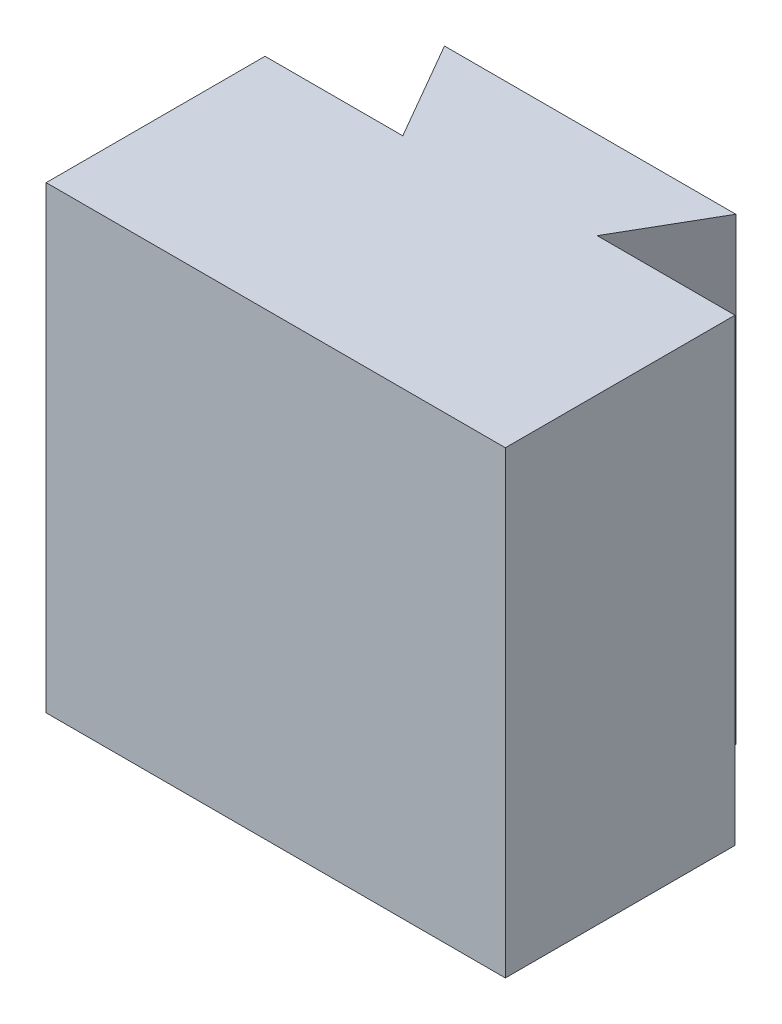
ISO-10303-21;
HEADER;
FILE_DESCRIPTION(('STEP AP214'),'2;1');
FILE_NAME('part.step','',(''),(''),'','','');
FILE_SCHEMA(('AUTOMOTIVE_DESIGN { 1 0 10303 214 1 1 1 1 }'));
ENDSEC;
DATA;
#1=APPLICATION_CONTEXT('core data for automotive mechanical design processes');
#2=APPLICATION_PROTOCOL_DEFINITION('international standard','automotive_design',2000,#1);
#3=PRODUCT_CONTEXT('',#1,'mechanical');
#4=PRODUCT('Part','Part','',(#3));
#5=PRODUCT_RELATED_PRODUCT_CATEGORY('part','',(#4));
#6=PRODUCT_DEFINITION_FORMATION('','',#4);
#7=PRODUCT_DEFINITION_CONTEXT('part definition',#1,'design');
#8=PRODUCT_DEFINITION('design','',#6,#7);
#9=PRODUCT_DEFINITION_SHAPE('','',#8);
#10=(LENGTH_UNIT() NAMED_UNIT(*) SI_UNIT(.MILLI.,.METRE.));
#11=(NAMED_UNIT(*) PLANE_ANGLE_UNIT() SI_UNIT($,.RADIAN.));
#12=(NAMED_UNIT(*) SI_UNIT($,.STERADIAN.) SOLID_ANGLE_UNIT());
#13=UNCERTAINTY_MEASURE_WITH_UNIT(LENGTH_MEASURE(1.E-05),#10,'distance_accuracy_value','');
#14=(GEOMETRIC_REPRESENTATION_CONTEXT(3) GLOBAL_UNCERTAINTY_ASSIGNED_CONTEXT((#13)) GLOBAL_UNIT_ASSIGNED_CONTEXT((#10,
#11,#12)) REPRESENTATION_CONTEXT('',''));
#15=CARTESIAN_POINT('',(0.,0.,0.));
#16=DIRECTION('',(0.,0.,1.));
#17=DIRECTION('',(1.,0.,0.));
#18=AXIS2_PLACEMENT_3D('',#15,#16,#17);
#19=CARTESIAN_POINT('',(-5.,-0.00999999999999959,0.234054964457145));
#20=DIRECTION('',(0.,0.,-1.));
#21=DIRECTION('',(-1.,0.,0.));
#22=AXIS2_PLACEMENT_3D('',#19,#20,#21);
#23=PLANE('',#22);
#24=DIRECTION('',(0.,1.,0.));
#25=VECTOR('',#24,1.);
#26=CARTESIAN_POINT('',(-2.,-0.00999999999999959,0.234054964457145));
#27=LINE('',#26,#25);
#28=CARTESIAN_POINT('',(-2.,0.,0.234054964457145));
#29=VERTEX_POINT('',#28);
#30=CARTESIAN_POINT('',(-2.,10.,0.234054964457145));
#31=VERTEX_POINT('',#30);
#32=EDGE_CURVE('E11',#29,#31,#27,.T.);
#33=ORIENTED_EDGE('',*,*,#32,.F.);
#34=DIRECTION('',(-1.,0.,0.));
#35=VECTOR('',#34,1.);
#36=CARTESIAN_POINT('',(0.,0.,0.234054964457145));
#37=LINE('',#36,#35);
#38=CARTESIAN_POINT('',(-5.,0.,0.234054964457145));
#39=VERTEX_POINT('',#38);
#40=EDGE_CURVE('E149',#29,#39,#37,.T.);
#41=ORIENTED_EDGE('',*,*,#40,.T.);
#42=DIRECTION('',(0.,1.,0.));
#43=VECTOR('',#42,1.);
#44=CARTESIAN_POINT('',(-5.,10.,0.234054964457145));
#45=LINE('',#44,#43);
#46=CARTESIAN_POINT('',(-5.,10.,0.234054964457145));
#47=VERTEX_POINT('',#46);
#48=EDGE_CURVE('E131',#39,#47,#45,.T.);
#49=ORIENTED_EDGE('',*,*,#48,.T.);
#50=DIRECTION('',(-1.,0.,0.));
#51=VECTOR('',#50,1.);
#52=CARTESIAN_POINT('',(0.,10.,0.234054964457145));
#53=LINE('',#52,#51);
#54=EDGE_CURVE('E165',#31,#47,#53,.T.);
#55=ORIENTED_EDGE('',*,*,#54,.F.);
#56=EDGE_LOOP('',(#33,#41,#49,#55));
#57=FACE_BOUND('',#56,.T.);
#58=ADVANCED_FACE('F43',(#57),#23,.T.);
#59=CARTESIAN_POINT('',(-2.,-0.00999999999999959,0.234054964457145));
#60=DIRECTION('',(-0.866025403784436,0.,0.500000000000004));
#61=DIRECTION('',(0.500000000000004,0.,0.866025403784436));
#62=AXIS2_PLACEMENT_3D('',#59,#60,#61);
#63=PLANE('',#62);
#64=DIRECTION('',(0.,1.,0.));
#65=VECTOR('',#64,1.);
#66=CARTESIAN_POINT('',(-3.2399584674678,-0.00999999999999959,-1.9136161004723));
#67=LINE('',#66,#65);
#68=CARTESIAN_POINT('',(-3.2399584674678,0.,-1.9136161004723));
#69=VERTEX_POINT('',#68);
#70=CARTESIAN_POINT('',(-3.2399584674678,10.,-1.9136161004723));
#71=VERTEX_POINT('',#70);
#72=EDGE_CURVE('E53',#69,#71,#67,.T.);
#73=ORIENTED_EDGE('',*,*,#72,.F.);
#74=DIRECTION('',(0.500000000000004,0.,0.866025403784436));
#75=VECTOR('',#74,1.);
#76=CARTESIAN_POINT('',(-1.60134877255087,0.,0.924539144898731));
#77=LINE('',#76,#75);
#78=EDGE_CURVE('E146',#69,#29,#77,.T.);
#79=ORIENTED_EDGE('',*,*,#78,.T.);
#80=ORIENTED_EDGE('',*,*,#32,.T.);
#81=DIRECTION('',(0.500000000000004,0.,0.866025403784436));
#82=VECTOR('',#81,1.);
#83=CARTESIAN_POINT('',(-1.60134877255087,10.,0.924539144898731));
#84=LINE('',#83,#82);
#85=EDGE_CURVE('E168',#71,#31,#84,.T.);
#86=ORIENTED_EDGE('',*,*,#85,.F.);
#87=EDGE_LOOP('',(#73,#79,#80,#86));
#88=FACE_BOUND('',#87,.T.);
#89=ADVANCED_FACE('F186',(#88),#63,.T.);
#90=CARTESIAN_POINT('',(-3.2399584674678,-0.00999999999999959,-1.9136161004723));
#91=DIRECTION('',(0.,0.,-1.));
#92=DIRECTION('',(-1.,0.,0.));
#93=AXIS2_PLACEMENT_3D('',#90,#91,#92);
#94=PLANE('',#93);
#95=DIRECTION('',(0.,1.,0.));
#96=VECTOR('',#95,1.);
#97=CARTESIAN_POINT('',(3.1048267707333,-0.00999999999999959,-1.9136161004723));
#98=LINE('',#97,#96);
#99=CARTESIAN_POINT('',(3.1048267707333,0.,-1.9136161004723));
#100=VERTEX_POINT('',#99);
#101=CARTESIAN_POINT('',(3.1048267707333,10.,-1.9136161004723));
#102=VERTEX_POINT('',#101);
#103=EDGE_CURVE('E162',#100,#102,#98,.T.);
#104=ORIENTED_EDGE('',*,*,#103,.F.);
#105=DIRECTION('',(-1.,0.,0.));
#106=VECTOR('',#105,1.);
#107=CARTESIAN_POINT('',(0.,0.,-1.9136161004723));
#108=LINE('',#107,#106);
#109=EDGE_CURVE('E141',#100,#69,#108,.T.);
#110=ORIENTED_EDGE('',*,*,#109,.T.);
#111=ORIENTED_EDGE('',*,*,#72,.T.);
#112=DIRECTION('',(-1.,0.,0.));
#113=VECTOR('',#112,1.);
#114=CARTESIAN_POINT('',(0.,10.,-1.9136161004723));
#115=LINE('',#114,#113);
#116=EDGE_CURVE('E171',#102,#71,#115,.T.);
#117=ORIENTED_EDGE('',*,*,#116,.F.);
#118=EDGE_LOOP('',(#104,#110,#111,#117));
#119=FACE_BOUND('',#118,.T.);
#120=ADVANCED_FACE('F182',(#119),#94,.T.);
#121=CARTESIAN_POINT('',(3.1048267707333,-0.00999999999999959,-1.9136161004723));
#122=DIRECTION('',(0.866025403784436,0.,0.500000000000004));
#123=DIRECTION('',(0.500000000000004,0.,-0.866025403784436));
#124=AXIS2_PLACEMENT_3D('',#121,#122,#123);
#125=PLANE('',#124);
#126=DIRECTION('',(0.,1.,0.));
#127=VECTOR('',#126,1.);
#128=CARTESIAN_POINT('',(2.,-0.00999999999999959,0.));
#129=LINE('',#128,#127);
#130=CARTESIAN_POINT('',(2.,0.,0.));
#131=VERTEX_POINT('',#130);
#132=CARTESIAN_POINT('',(2.,10.,0.));
#133=VERTEX_POINT('',#132);
#134=EDGE_CURVE('E124',#131,#133,#129,.T.);
#135=ORIENTED_EDGE('',*,*,#134,.F.);
#136=DIRECTION('',(0.500000000000004,0.,-0.866025403784436));
#137=VECTOR('',#136,1.);
#138=CARTESIAN_POINT('',(1.49999999999999,0.,0.866025403784443));
#139=LINE('',#138,#137);
#140=EDGE_CURVE('E137',#131,#100,#139,.T.);
#141=ORIENTED_EDGE('',*,*,#140,.T.);
#142=ORIENTED_EDGE('',*,*,#103,.T.);
#143=DIRECTION('',(0.500000000000004,0.,-0.866025403784436));
#144=VECTOR('',#143,1.);
#145=CARTESIAN_POINT('',(1.49999999999999,10.,0.866025403784443));
#146=LINE('',#145,#144);
#147=EDGE_CURVE('E174',#133,#102,#146,.T.);
#148=ORIENTED_EDGE('',*,*,#147,.F.);
#149=EDGE_LOOP('',(#135,#141,#142,#148));
#150=FACE_BOUND('',#149,.T.);
#151=ADVANCED_FACE('F180',(#150),#125,.T.);
#152=CARTESIAN_POINT('',(2.,-0.00999999999999959,0.));
#153=DIRECTION('',(0.,0.,-1.));
#154=DIRECTION('',(-1.,0.,0.));
#155=AXIS2_PLACEMENT_3D('',#152,#153,#154);
#156=PLANE('',#155);
#157=DIRECTION('',(0.,-1.,0.));
#158=VECTOR('',#157,1.);
#159=CARTESIAN_POINT('',(5.,10.,0.));
#160=LINE('',#159,#158);
#161=CARTESIAN_POINT('',(5.,10.,0.));
#162=VERTEX_POINT('',#161);
#163=CARTESIAN_POINT('',(5.,0.,0.));
#164=VERTEX_POINT('',#163);
#165=EDGE_CURVE('E119',#162,#164,#160,.T.);
#166=ORIENTED_EDGE('',*,*,#165,.T.);
#167=DIRECTION('',(-1.,0.,0.));
#168=VECTOR('',#167,1.);
#169=CARTESIAN_POINT('',(0.,0.,0.));
#170=LINE('',#169,#168);
#171=EDGE_CURVE('E128',#164,#131,#170,.T.);
#172=ORIENTED_EDGE('',*,*,#171,.T.);
#173=ORIENTED_EDGE('',*,*,#134,.T.);
#174=DIRECTION('',(-1.,0.,0.));
#175=VECTOR('',#174,1.);
#176=CARTESIAN_POINT('',(0.,10.,0.));
#177=LINE('',#176,#175);
#178=EDGE_CURVE('E130',#162,#133,#177,.T.);
#179=ORIENTED_EDGE('',*,*,#178,.F.);
#180=EDGE_LOOP('',(#166,#172,#173,#179));
#181=FACE_BOUND('',#180,.T.);
#182=ADVANCED_FACE('F127',(#181),#156,.T.);
#183=CARTESIAN_POINT('',(0.,0.,0.));
#184=DIRECTION('',(0.,1.,0.));
#185=DIRECTION('',(0.,0.,1.));
#186=AXIS2_PLACEMENT_3D('',#183,#184,#185);
#187=PLANE('',#186);
#188=ORIENTED_EDGE('',*,*,#171,.F.);
#189=DIRECTION('',(0.,0.,-1.));
#190=VECTOR('',#189,1.);
#191=CARTESIAN_POINT('',(5.,0.,-5.));
#192=LINE('',#191,#190);
#193=CARTESIAN_POINT('',(5.,0.,5.));
#194=VERTEX_POINT('',#193);
#195=EDGE_CURVE('E47',#194,#164,#192,.T.);
#196=ORIENTED_EDGE('',*,*,#195,.F.);
#197=DIRECTION('',(1.,0.,0.));
#198=VECTOR('',#197,1.);
#199=CARTESIAN_POINT('',(-5.,0.,5.));
#200=LINE('',#199,#198);
#201=CARTESIAN_POINT('',(-5.,0.,5.));
#202=VERTEX_POINT('',#201);
#203=EDGE_CURVE('E154',#202,#194,#200,.T.);
#204=ORIENTED_EDGE('',*,*,#203,.F.);
#205=DIRECTION('',(0.,0.,1.));
#206=VECTOR('',#205,1.);
#207=CARTESIAN_POINT('',(-5.,0.,-5.));
#208=LINE('',#207,#206);
#209=EDGE_CURVE('E62',#39,#202,#208,.T.);
#210=ORIENTED_EDGE('',*,*,#209,.F.);
#211=ORIENTED_EDGE('',*,*,#40,.F.);
#212=ORIENTED_EDGE('',*,*,#78,.F.);
#213=ORIENTED_EDGE('',*,*,#109,.F.);
#214=ORIENTED_EDGE('',*,*,#140,.F.);
#215=EDGE_LOOP('',(#188,#196,#204,#210,#211,#212,#213,#214));
#216=FACE_BOUND('',#215,.T.);
#217=ADVANCED_FACE('F134',(#216),#187,.F.);
#218=CARTESIAN_POINT('',(5.,10.,-5.));
#219=DIRECTION('',(-1.,0.,0.));
#220=DIRECTION('',(0.,0.,1.));
#221=AXIS2_PLACEMENT_3D('',#218,#219,#220);
#222=PLANE('',#221);
#223=ORIENTED_EDGE('',*,*,#165,.F.);
#224=DIRECTION('',(0.,0.,-1.));
#225=VECTOR('',#224,1.);
#226=CARTESIAN_POINT('',(5.,10.,-5.));
#227=LINE('',#226,#225);
#228=CARTESIAN_POINT('',(5.,10.,5.));
#229=VERTEX_POINT('',#228);
#230=EDGE_CURVE('E153',#229,#162,#227,.T.);
#231=ORIENTED_EDGE('',*,*,#230,.F.);
#232=DIRECTION('',(0.,-1.,0.));
#233=VECTOR('',#232,1.);
#234=CARTESIAN_POINT('',(5.,10.,5.));
#235=LINE('',#234,#233);
#236=EDGE_CURVE('E120',#229,#194,#235,.T.);
#237=ORIENTED_EDGE('',*,*,#236,.T.);
#238=ORIENTED_EDGE('',*,*,#195,.T.);
#239=EDGE_LOOP('',(#223,#231,#237,#238));
#240=FACE_BOUND('',#239,.T.);
#241=ADVANCED_FACE('F117',(#240),#222,.F.);
#242=CARTESIAN_POINT('',(-5.,10.,5.));
#243=DIRECTION('',(0.,0.,-1.));
#244=DIRECTION('',(-1.,0.,0.));
#245=AXIS2_PLACEMENT_3D('',#242,#243,#244);
#246=PLANE('',#245);
#247=ORIENTED_EDGE('',*,*,#203,.T.);
#248=ORIENTED_EDGE('',*,*,#236,.F.);
#249=DIRECTION('',(1.,0.,0.));
#250=VECTOR('',#249,1.);
#251=CARTESIAN_POINT('',(-5.,10.,5.));
#252=LINE('',#251,#250);
#253=CARTESIAN_POINT('',(-5.,10.,5.));
#254=VERTEX_POINT('',#253);
#255=EDGE_CURVE('E74',#254,#229,#252,.T.);
#256=ORIENTED_EDGE('',*,*,#255,.F.);
#257=DIRECTION('',(0.,-1.,0.));
#258=VECTOR('',#257,1.);
#259=CARTESIAN_POINT('',(-5.,10.,5.));
#260=LINE('',#259,#258);
#261=EDGE_CURVE('E167',#254,#202,#260,.T.);
#262=ORIENTED_EDGE('',*,*,#261,.T.);
#263=EDGE_LOOP('',(#247,#248,#256,#262));
#264=FACE_BOUND('',#263,.T.);
#265=ADVANCED_FACE('F189',(#264),#246,.F.);
#266=CARTESIAN_POINT('',(-5.,10.,-5.));
#267=DIRECTION('',(1.,0.,0.));
#268=DIRECTION('',(0.,0.,-1.));
#269=AXIS2_PLACEMENT_3D('',#266,#267,#268);
#270=PLANE('',#269);
#271=ORIENTED_EDGE('',*,*,#48,.F.);
#272=ORIENTED_EDGE('',*,*,#209,.T.);
#273=ORIENTED_EDGE('',*,*,#261,.F.);
#274=DIRECTION('',(0.,0.,1.));
#275=VECTOR('',#274,1.);
#276=CARTESIAN_POINT('',(-5.,10.,-5.));
#277=LINE('',#276,#275);
#278=EDGE_CURVE('E151',#47,#254,#277,.T.);
#279=ORIENTED_EDGE('',*,*,#278,.F.);
#280=EDGE_LOOP('',(#271,#272,#273,#279));
#281=FACE_BOUND('',#280,.T.);
#282=ADVANCED_FACE('F188',(#281),#270,.F.);
#283=CARTESIAN_POINT('',(0.,10.,0.));
#284=DIRECTION('',(0.,1.,0.));
#285=DIRECTION('',(0.,0.,1.));
#286=AXIS2_PLACEMENT_3D('',#283,#284,#285);
#287=PLANE('',#286);
#288=ORIENTED_EDGE('',*,*,#230,.T.);
#289=ORIENTED_EDGE('',*,*,#178,.T.);
#290=ORIENTED_EDGE('',*,*,#147,.T.);
#291=ORIENTED_EDGE('',*,*,#116,.T.);
#292=ORIENTED_EDGE('',*,*,#85,.T.);
#293=ORIENTED_EDGE('',*,*,#54,.T.);
#294=ORIENTED_EDGE('',*,*,#278,.T.);
#295=ORIENTED_EDGE('',*,*,#255,.T.);
#296=EDGE_LOOP('',(#288,#289,#290,#291,#292,#293,#294,#295));
#297=FACE_BOUND('',#296,.T.);
#298=ADVANCED_FACE('F45',(#297),#287,.T.);
#299=CLOSED_SHELL('',(#58,#89,#120,#151,#182,#217,#241,#265,#282,#298));
#300=MANIFOLD_SOLID_BREP('B2',#299);
#301=ADVANCED_BREP_SHAPE_REPRESENTATION('',(#18,#300),#14);
#302=SHAPE_DEFINITION_REPRESENTATION(#9,#301);
ENDSEC;
END-ISO-10303-21;
